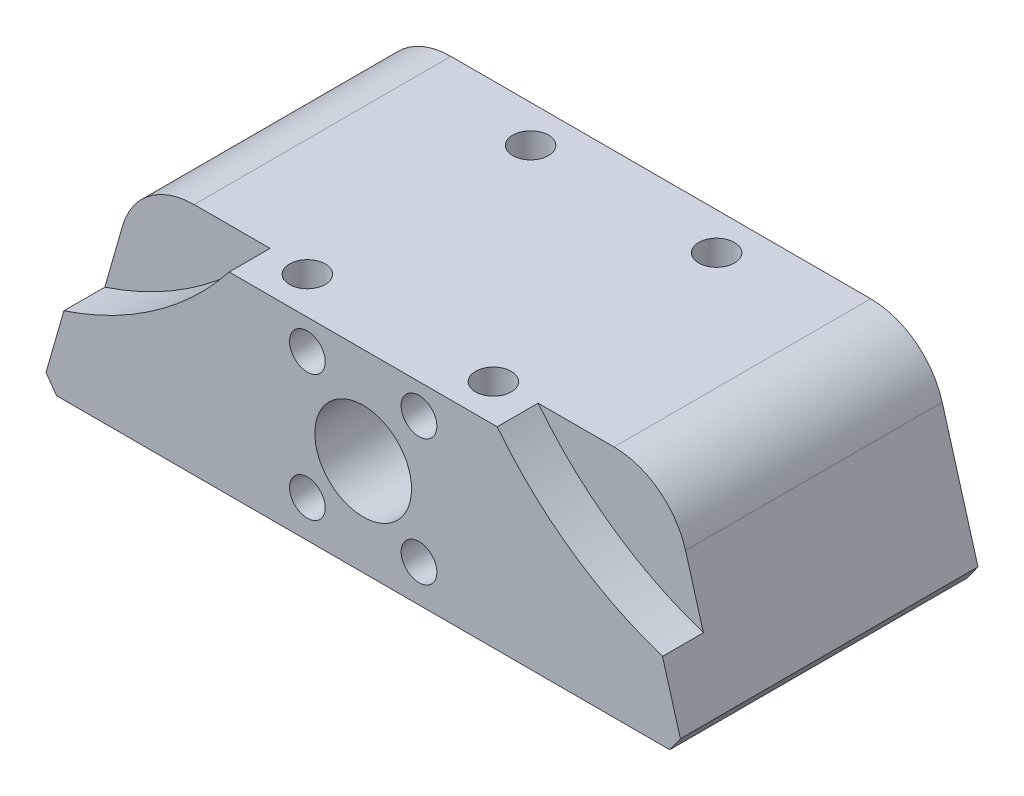
ISO-10303-21;
HEADER;
FILE_DESCRIPTION(('STEP AP214'),'2;1');
FILE_NAME('part.step','',(''),(''),'','','');
FILE_SCHEMA(('AUTOMOTIVE_DESIGN { 1 0 10303 214 1 1 1 1 }'));
ENDSEC;
DATA;
#1=APPLICATION_CONTEXT('core data for automotive mechanical design processes');
#2=APPLICATION_PROTOCOL_DEFINITION('international standard','automotive_design',2000,#1);
#3=PRODUCT_CONTEXT('',#1,'mechanical');
#4=PRODUCT('Part','Part','',(#3));
#5=PRODUCT_RELATED_PRODUCT_CATEGORY('part','',(#4));
#6=PRODUCT_DEFINITION_FORMATION('','',#4);
#7=PRODUCT_DEFINITION_CONTEXT('part definition',#1,'design');
#8=PRODUCT_DEFINITION('design','',#6,#7);
#9=PRODUCT_DEFINITION_SHAPE('','',#8);
#10=(LENGTH_UNIT() NAMED_UNIT(*) SI_UNIT(.MILLI.,.METRE.));
#11=(NAMED_UNIT(*) PLANE_ANGLE_UNIT() SI_UNIT($,.RADIAN.));
#12=(NAMED_UNIT(*) SI_UNIT($,.STERADIAN.) SOLID_ANGLE_UNIT());
#13=UNCERTAINTY_MEASURE_WITH_UNIT(LENGTH_MEASURE(1.E-05),#10,'distance_accuracy_value','');
#14=(GEOMETRIC_REPRESENTATION_CONTEXT(3) GLOBAL_UNCERTAINTY_ASSIGNED_CONTEXT((#13)) GLOBAL_UNIT_ASSIGNED_CONTEXT((#10,
#11,#12)) REPRESENTATION_CONTEXT('',''));
#15=CARTESIAN_POINT('',(0.,0.,0.));
#16=DIRECTION('',(0.,0.,1.));
#17=DIRECTION('',(1.,0.,0.));
#18=AXIS2_PLACEMENT_3D('',#15,#16,#17);
#19=CARTESIAN_POINT('',(-20.7121406356452,11.,40.));
#20=DIRECTION('',(0.,0.,-1.));
#21=DIRECTION('',(-1.,0.,0.));
#22=AXIS2_PLACEMENT_3D('',#19,#20,#21);
#23=CYLINDRICAL_SURFACE('',#22,10.);
#24=DIRECTION('',(0.,0.,-1.));
#25=VECTOR('',#24,1.);
#26=CARTESIAN_POINT('',(-30.3247575950284,13.75637355817,40.));
#27=LINE('',#26,#25);
#28=CARTESIAN_POINT('',(-30.3247575950284,13.75637355817,34.5));
#29=VERTEX_POINT('',#28);
#30=CARTESIAN_POINT('',(-30.3247575950284,13.75637355817,0.));
#31=VERTEX_POINT('',#30);
#32=EDGE_CURVE('E202',#29,#31,#27,.T.);
#33=ORIENTED_EDGE('',*,*,#32,.F.);
#34=CARTESIAN_POINT('',(-20.7121406356452,11.,34.5));
#35=DIRECTION('',(0.,0.,1.));
#36=DIRECTION('',(1.,0.,0.));
#37=AXIS2_PLACEMENT_3D('',#34,#35,#36);
#38=CIRCLE('',#37,10.);
#39=CARTESIAN_POINT('',(-20.7121406356452,21.,34.5));
#40=VERTEX_POINT('',#39);
#41=EDGE_CURVE('E205',#29,#40,#38,.F.);
#42=ORIENTED_EDGE('',*,*,#41,.T.);
#43=DIRECTION('',(0.,0.,-1.));
#44=VECTOR('',#43,1.);
#45=CARTESIAN_POINT('',(-20.7121406356452,21.,40.));
#46=LINE('',#45,#44);
#47=CARTESIAN_POINT('',(-20.7121406356452,21.,0.));
#48=VERTEX_POINT('',#47);
#49=EDGE_CURVE('E173',#48,#40,#46,.F.);
#50=ORIENTED_EDGE('',*,*,#49,.F.);
#51=CARTESIAN_POINT('',(-20.7121406356452,11.,0.));
#52=DIRECTION('',(0.,0.,1.));
#53=DIRECTION('',(1.,0.,0.));
#54=AXIS2_PLACEMENT_3D('',#51,#52,#53);
#55=CIRCLE('',#54,10.);
#56=EDGE_CURVE('E191',#31,#48,#55,.F.);
#57=ORIENTED_EDGE('',*,*,#56,.F.);
#58=EDGE_LOOP('',(#33,#42,#50,#57));
#59=FACE_BOUND('',#58,.T.);
#60=ADVANCED_FACE('F39',(#59),#23,.T.);
#61=CARTESIAN_POINT('',(0.,0.,40.));
#62=DIRECTION('',(0.,0.,1.));
#63=DIRECTION('',(1.,0.,0.));
#64=AXIS2_PLACEMENT_3D('',#61,#62,#63);
#65=PLANE('',#64);
#66=DIRECTION('',(0.580682206213755,0.814130318429873,0.));
#67=VECTOR('',#66,1.);
#68=CARTESIAN_POINT('',(50.1295703948846,-2.99999999999999,40.));
#69=LINE('',#68,#67);
#70=CARTESIAN_POINT('',(48.7030611664022,-4.99999999999999,40.));
#71=VERTEX_POINT('',#70);
#72=CARTESIAN_POINT('',(50.1295703948846,-2.99999999999999,40.));
#73=VERTEX_POINT('',#72);
#74=EDGE_CURVE('E54',#71,#73,#69,.T.);
#75=ORIENTED_EDGE('',*,*,#74,.T.);
#76=DIRECTION('',(-0.275637355817003,0.961261695938318,0.));
#77=VECTOR('',#76,1.);
#78=CARTESIAN_POINT('',(43.2476811366731,21.,40.));
#79=LINE('',#78,#77);
#80=CARTESIAN_POINT('',(47.7259466078998,5.3824323122901,40.));
#81=VERTEX_POINT('',#80);
#82=EDGE_CURVE('E141',#73,#81,#79,.T.);
#83=ORIENTED_EDGE('',*,*,#82,.T.);
#84=CARTESIAN_POINT('',(62.5,50.,40.));
#85=DIRECTION('',(0.,0.,1.));
#86=DIRECTION('',(-1.,0.,0.));
#87=AXIS2_PLACEMENT_3D('',#84,#85,#86);
#88=CIRCLE('',#87,47.);
#89=CARTESIAN_POINT('',(25.5135159821861,21.,40.));
#90=VERTEX_POINT('',#89);
#91=EDGE_CURVE('E236',#90,#81,#88,.T.);
#92=ORIENTED_EDGE('',*,*,#91,.F.);
#93=DIRECTION('',(-1.,0.,0.));
#94=VECTOR('',#93,1.);
#95=CARTESIAN_POINT('',(-28.2476811366731,21.,40.));
#96=LINE('',#95,#94);
#97=CARTESIAN_POINT('',(-10.5135159821861,21.,40.));
#98=VERTEX_POINT('',#97);
#99=EDGE_CURVE('E153',#90,#98,#96,.T.);
#100=ORIENTED_EDGE('',*,*,#99,.T.);
#101=CARTESIAN_POINT('',(-47.5,50.,40.));
#102=DIRECTION('',(0.,0.,1.));
#103=DIRECTION('',(1.,0.,0.));
#104=AXIS2_PLACEMENT_3D('',#101,#102,#103);
#105=CIRCLE('',#104,47.);
#106=CARTESIAN_POINT('',(-32.7259466078998,5.38243231229012,40.));
#107=VERTEX_POINT('',#106);
#108=EDGE_CURVE('E224',#107,#98,#105,.T.);
#109=ORIENTED_EDGE('',*,*,#108,.F.);
#110=DIRECTION('',(-0.275637355817003,-0.961261695938318,0.));
#111=VECTOR('',#110,1.);
#112=CARTESIAN_POINT('',(-28.2476811366731,21.,40.));
#113=LINE('',#112,#111);
#114=CARTESIAN_POINT('',(-35.1295703948846,-2.99999999999998,40.));
#115=VERTEX_POINT('',#114);
#116=EDGE_CURVE('E159',#107,#115,#113,.T.);
#117=ORIENTED_EDGE('',*,*,#116,.T.);
#118=DIRECTION('',(0.580682206213755,-0.814130318429873,0.));
#119=VECTOR('',#118,1.);
#120=CARTESIAN_POINT('',(-35.1295703948846,-2.99999999999998,40.));
#121=LINE('',#120,#119);
#122=CARTESIAN_POINT('',(-33.7030611664022,-4.99999999999998,40.));
#123=VERTEX_POINT('',#122);
#124=EDGE_CURVE('E361',#115,#123,#121,.T.);
#125=ORIENTED_EDGE('',*,*,#124,.T.);
#126=DIRECTION('',(1.,0.,0.));
#127=VECTOR('',#126,1.);
#128=CARTESIAN_POINT('',(-35.7030611664022,-5.,40.));
#129=LINE('',#128,#127);
#130=EDGE_CURVE('E145',#123,#71,#129,.T.);
#131=ORIENTED_EDGE('',*,*,#130,.T.);
#132=EDGE_LOOP('',(#75,#83,#92,#100,#109,#117,#125,#131));
#133=FACE_BOUND('',#132,.T.);
#134=CARTESIAN_POINT('',(0.,0.,40.));
#135=DIRECTION('',(0.,0.,1.));
#136=DIRECTION('',(1.,0.,0.));
#137=AXIS2_PLACEMENT_3D('',#134,#135,#136);
#138=CIRCLE('',#137,2.4);
#139=CARTESIAN_POINT('',(2.4,0.,40.));
#140=VERTEX_POINT('',#139);
#141=EDGE_CURVE('E300',#140,#140,#138,.T.);
#142=ORIENTED_EDGE('',*,*,#141,.F.);
#143=EDGE_LOOP('',(#142));
#144=FACE_BOUND('',#143,.T.);
#145=CARTESIAN_POINT('',(15.,0.,40.));
#146=DIRECTION('',(0.,0.,1.));
#147=DIRECTION('',(1.,0.,0.));
#148=AXIS2_PLACEMENT_3D('',#145,#146,#147);
#149=CIRCLE('',#148,2.4);
#150=CARTESIAN_POINT('',(17.4,0.,40.));
#151=VERTEX_POINT('',#150);
#152=EDGE_CURVE('E316',#151,#151,#149,.T.);
#153=ORIENTED_EDGE('',*,*,#152,.F.);
#154=EDGE_LOOP('',(#153));
#155=FACE_BOUND('',#154,.T.);
#156=CARTESIAN_POINT('',(15.,17.,40.));
#157=DIRECTION('',(0.,0.,1.));
#158=DIRECTION('',(1.,0.,0.));
#159=AXIS2_PLACEMENT_3D('',#156,#157,#158);
#160=CIRCLE('',#159,2.4);
#161=CARTESIAN_POINT('',(17.4,17.,40.));
#162=VERTEX_POINT('',#161);
#163=EDGE_CURVE('E178',#162,#162,#160,.T.);
#164=ORIENTED_EDGE('',*,*,#163,.F.);
#165=EDGE_LOOP('',(#164));
#166=FACE_BOUND('',#165,.T.);
#167=CARTESIAN_POINT('',(0.,17.,40.));
#168=DIRECTION('',(0.,0.,1.));
#169=DIRECTION('',(1.,0.,0.));
#170=AXIS2_PLACEMENT_3D('',#167,#168,#169);
#171=CIRCLE('',#170,2.4);
#172=CARTESIAN_POINT('',(2.4,17.,40.));
#173=VERTEX_POINT('',#172);
#174=EDGE_CURVE('E308',#173,#173,#171,.T.);
#175=ORIENTED_EDGE('',*,*,#174,.F.);
#176=EDGE_LOOP('',(#175));
#177=FACE_BOUND('',#176,.T.);
#178=CARTESIAN_POINT('',(7.5,8.,40.));
#179=DIRECTION('',(0.,0.,1.));
#180=DIRECTION('',(1.,0.,0.));
#181=AXIS2_PLACEMENT_3D('',#178,#179,#180);
#182=CIRCLE('',#181,6.5);
#183=CARTESIAN_POINT('',(14.,8.,40.));
#184=VERTEX_POINT('',#183);
#185=EDGE_CURVE('E292',#184,#184,#182,.T.);
#186=ORIENTED_EDGE('',*,*,#185,.F.);
#187=EDGE_LOOP('',(#186));
#188=FACE_BOUND('',#187,.T.);
#189=ADVANCED_FACE('F138',(#133,#144,#155,#166,#177,#188),#65,.T.);
#190=CARTESIAN_POINT('',(0.,0.,0.));
#191=DIRECTION('',(0.,0.,1.));
#192=DIRECTION('',(1.,0.,0.));
#193=AXIS2_PLACEMENT_3D('',#190,#191,#192);
#194=PLANE('',#193);
#195=DIRECTION('',(-0.275637355817003,0.961261695938318,0.));
#196=VECTOR('',#195,1.);
#197=CARTESIAN_POINT('',(43.2476811366731,21.,0.));
#198=LINE('',#197,#196);
#199=CARTESIAN_POINT('',(50.1295703948846,-2.99999999999999,0.));
#200=VERTEX_POINT('',#199);
#201=CARTESIAN_POINT('',(45.3247575950284,13.75637355817,0.));
#202=VERTEX_POINT('',#201);
#203=EDGE_CURVE('E174',#200,#202,#198,.T.);
#204=ORIENTED_EDGE('',*,*,#203,.F.);
#205=DIRECTION('',(0.580682206213755,0.814130318429873,0.));
#206=VECTOR('',#205,1.);
#207=CARTESIAN_POINT('',(50.1295703948846,-2.99999999999999,0.));
#208=LINE('',#207,#206);
#209=CARTESIAN_POINT('',(48.7030611664022,-4.99999999999999,0.));
#210=VERTEX_POINT('',#209);
#211=EDGE_CURVE('E129',#210,#200,#208,.T.);
#212=ORIENTED_EDGE('',*,*,#211,.F.);
#213=DIRECTION('',(1.,0.,0.));
#214=VECTOR('',#213,1.);
#215=CARTESIAN_POINT('',(-35.7030611664022,-5.,0.));
#216=LINE('',#215,#214);
#217=CARTESIAN_POINT('',(-33.7030611664022,-5.,0.));
#218=VERTEX_POINT('',#217);
#219=EDGE_CURVE('E154',#218,#210,#216,.T.);
#220=ORIENTED_EDGE('',*,*,#219,.F.);
#221=DIRECTION('',(0.580682206213755,-0.814130318429873,0.));
#222=VECTOR('',#221,1.);
#223=CARTESIAN_POINT('',(-35.1295703948846,-2.99999999999998,0.));
#224=LINE('',#223,#222);
#225=CARTESIAN_POINT('',(-35.1295703948846,-2.99999999999998,0.));
#226=VERTEX_POINT('',#225);
#227=EDGE_CURVE('E62',#226,#218,#224,.T.);
#228=ORIENTED_EDGE('',*,*,#227,.F.);
#229=DIRECTION('',(-0.275637355817003,-0.961261695938318,0.));
#230=VECTOR('',#229,1.);
#231=CARTESIAN_POINT('',(-28.2476811366731,21.,0.));
#232=LINE('',#231,#230);
#233=EDGE_CURVE('E162',#31,#226,#232,.T.);
#234=ORIENTED_EDGE('',*,*,#233,.F.);
#235=ORIENTED_EDGE('',*,*,#56,.T.);
#236=DIRECTION('',(-1.,0.,0.));
#237=VECTOR('',#236,1.);
#238=CARTESIAN_POINT('',(-28.2476811366731,21.,0.));
#239=LINE('',#238,#237);
#240=CARTESIAN_POINT('',(35.7121406356452,21.,0.));
#241=VERTEX_POINT('',#240);
#242=EDGE_CURVE('E177',#241,#48,#239,.T.);
#243=ORIENTED_EDGE('',*,*,#242,.F.);
#244=CARTESIAN_POINT('',(35.7121406356452,11.,0.));
#245=DIRECTION('',(0.,0.,1.));
#246=DIRECTION('',(1.,0.,0.));
#247=AXIS2_PLACEMENT_3D('',#244,#245,#246);
#248=CIRCLE('',#247,10.);
#249=EDGE_CURVE('E194',#241,#202,#248,.F.);
#250=ORIENTED_EDGE('',*,*,#249,.T.);
#251=EDGE_LOOP('',(#204,#212,#220,#228,#234,#235,#243,#250));
#252=FACE_BOUND('',#251,.T.);
#253=CARTESIAN_POINT('',(15.,17.,0.));
#254=DIRECTION('',(0.,0.,1.));
#255=DIRECTION('',(1.,0.,0.));
#256=AXIS2_PLACEMENT_3D('',#253,#254,#255);
#257=CIRCLE('',#256,2.4);
#258=CARTESIAN_POINT('',(17.4,17.,0.));
#259=VERTEX_POINT('',#258);
#260=EDGE_CURVE('E165',#259,#259,#257,.T.);
#261=ORIENTED_EDGE('',*,*,#260,.T.);
#262=EDGE_LOOP('',(#261));
#263=FACE_BOUND('',#262,.T.);
#264=CARTESIAN_POINT('',(15.,0.,0.));
#265=DIRECTION('',(0.,0.,1.));
#266=DIRECTION('',(1.,0.,0.));
#267=AXIS2_PLACEMENT_3D('',#264,#265,#266);
#268=CIRCLE('',#267,2.4);
#269=CARTESIAN_POINT('',(17.4,0.,0.));
#270=VERTEX_POINT('',#269);
#271=EDGE_CURVE('E312',#270,#270,#268,.T.);
#272=ORIENTED_EDGE('',*,*,#271,.T.);
#273=EDGE_LOOP('',(#272));
#274=FACE_BOUND('',#273,.T.);
#275=CARTESIAN_POINT('',(0.,17.,0.));
#276=DIRECTION('',(0.,0.,1.));
#277=DIRECTION('',(1.,0.,0.));
#278=AXIS2_PLACEMENT_3D('',#275,#276,#277);
#279=CIRCLE('',#278,2.4);
#280=CARTESIAN_POINT('',(2.4,17.,0.));
#281=VERTEX_POINT('',#280);
#282=EDGE_CURVE('E304',#281,#281,#279,.T.);
#283=ORIENTED_EDGE('',*,*,#282,.T.);
#284=EDGE_LOOP('',(#283));
#285=FACE_BOUND('',#284,.T.);
#286=CARTESIAN_POINT('',(0.,0.,0.));
#287=DIRECTION('',(0.,0.,1.));
#288=DIRECTION('',(1.,0.,0.));
#289=AXIS2_PLACEMENT_3D('',#286,#287,#288);
#290=CIRCLE('',#289,2.4);
#291=CARTESIAN_POINT('',(2.4,0.,0.));
#292=VERTEX_POINT('',#291);
#293=EDGE_CURVE('E296',#292,#292,#290,.T.);
#294=ORIENTED_EDGE('',*,*,#293,.T.);
#295=EDGE_LOOP('',(#294));
#296=FACE_BOUND('',#295,.T.);
#297=CARTESIAN_POINT('',(7.5,8.,0.));
#298=DIRECTION('',(0.,0.,1.));
#299=DIRECTION('',(1.,0.,0.));
#300=AXIS2_PLACEMENT_3D('',#297,#298,#299);
#301=CIRCLE('',#300,6.5);
#302=CARTESIAN_POINT('',(14.,8.,0.));
#303=VERTEX_POINT('',#302);
#304=EDGE_CURVE('E288',#303,#303,#301,.T.);
#305=ORIENTED_EDGE('',*,*,#304,.T.);
#306=EDGE_LOOP('',(#305));
#307=FACE_BOUND('',#306,.T.);
#308=ADVANCED_FACE('F330',(#252,#263,#274,#285,#296,#307),#194,.F.);
#309=CARTESIAN_POINT('',(43.2476811366731,21.,40.));
#310=DIRECTION('',(-0.961261695938318,-0.275637355817003,0.));
#311=DIRECTION('',(0.275637355817003,-0.961261695938318,0.));
#312=AXIS2_PLACEMENT_3D('',#309,#310,#311);
#313=PLANE('',#312);
#314=ORIENTED_EDGE('',*,*,#82,.F.);
#315=DIRECTION('',(0.,0.,-1.));
#316=VECTOR('',#315,1.);
#317=CARTESIAN_POINT('',(50.1295703948846,-2.99999999999999,40.));
#318=LINE('',#317,#316);
#319=EDGE_CURVE('E126',#73,#200,#318,.T.);
#320=ORIENTED_EDGE('',*,*,#319,.T.);
#321=ORIENTED_EDGE('',*,*,#203,.T.);
#322=DIRECTION('',(0.,0.,-1.));
#323=VECTOR('',#322,1.);
#324=CARTESIAN_POINT('',(45.3247575950284,13.75637355817,40.));
#325=LINE('',#324,#323);
#326=CARTESIAN_POINT('',(45.3247575950284,13.75637355817,34.5));
#327=VERTEX_POINT('',#326);
#328=EDGE_CURVE('E198',#202,#327,#325,.F.);
#329=ORIENTED_EDGE('',*,*,#328,.T.);
#330=DIRECTION('',(0.275637355817003,-0.961261695938318,0.));
#331=VECTOR('',#330,1.);
#332=CARTESIAN_POINT('',(43.2476811366731,21.,34.5));
#333=LINE('',#332,#331);
#334=CARTESIAN_POINT('',(47.7259466078998,5.3824323122901,34.5));
#335=VERTEX_POINT('',#334);
#336=EDGE_CURVE('E251',#327,#335,#333,.T.);
#337=ORIENTED_EDGE('',*,*,#336,.T.);
#338=DIRECTION('',(0.,0.,1.));
#339=VECTOR('',#338,1.);
#340=CARTESIAN_POINT('',(47.7259466078998,5.3824323122901,34.5));
#341=LINE('',#340,#339);
#342=EDGE_CURVE('E151',#335,#81,#341,.T.);
#343=ORIENTED_EDGE('',*,*,#342,.T.);
#344=EDGE_LOOP('',(#314,#320,#321,#329,#337,#343));
#345=FACE_BOUND('',#344,.T.);
#346=ADVANCED_FACE('F149',(#345),#313,.F.);
#347=CARTESIAN_POINT('',(-28.2476811366731,21.,40.));
#348=DIRECTION('',(0.,-1.,0.));
#349=DIRECTION('',(1.,0.,0.));
#350=AXIS2_PLACEMENT_3D('',#347,#348,#349);
#351=PLANE('',#350);
#352=CARTESIAN_POINT('',(20.,21.,5.));
#353=DIRECTION('',(0.,1.,0.));
#354=DIRECTION('',(-1.,0.,0.));
#355=AXIS2_PLACEMENT_3D('',#352,#353,#354);
#356=CIRCLE('',#355,2.4);
#357=CARTESIAN_POINT('',(17.6,21.,5.));
#358=VERTEX_POINT('',#357);
#359=EDGE_CURVE('E273',#358,#358,#356,.T.);
#360=ORIENTED_EDGE('',*,*,#359,.F.);
#361=EDGE_LOOP('',(#360));
#362=FACE_BOUND('',#361,.T.);
#363=CARTESIAN_POINT('',(-5.00000000000001,21.,35.));
#364=DIRECTION('',(0.,1.,0.));
#365=DIRECTION('',(-1.,0.,0.));
#366=AXIS2_PLACEMENT_3D('',#363,#364,#365);
#367=CIRCLE('',#366,2.4);
#368=CARTESIAN_POINT('',(-7.40000000000001,21.,35.));
#369=VERTEX_POINT('',#368);
#370=EDGE_CURVE('E264',#369,#369,#367,.T.);
#371=ORIENTED_EDGE('',*,*,#370,.F.);
#372=EDGE_LOOP('',(#371));
#373=FACE_BOUND('',#372,.T.);
#374=CARTESIAN_POINT('',(20.,21.,35.));
#375=DIRECTION('',(0.,1.,0.));
#376=DIRECTION('',(-1.,0.,0.));
#377=AXIS2_PLACEMENT_3D('',#374,#375,#376);
#378=CIRCLE('',#377,2.4);
#379=CARTESIAN_POINT('',(17.6,21.,35.));
#380=VERTEX_POINT('',#379);
#381=EDGE_CURVE('E259',#380,#380,#378,.T.);
#382=ORIENTED_EDGE('',*,*,#381,.F.);
#383=EDGE_LOOP('',(#382));
#384=FACE_BOUND('',#383,.T.);
#385=CARTESIAN_POINT('',(-5.00000000000001,21.,5.));
#386=DIRECTION('',(0.,1.,0.));
#387=DIRECTION('',(-1.,0.,0.));
#388=AXIS2_PLACEMENT_3D('',#385,#386,#387);
#389=CIRCLE('',#388,2.4);
#390=CARTESIAN_POINT('',(-7.40000000000001,21.,5.));
#391=VERTEX_POINT('',#390);
#392=EDGE_CURVE('E272',#391,#391,#389,.T.);
#393=ORIENTED_EDGE('',*,*,#392,.F.);
#394=EDGE_LOOP('',(#393));
#395=FACE_BOUND('',#394,.T.);
#396=DIRECTION('',(-1.,0.,0.));
#397=VECTOR('',#396,1.);
#398=CARTESIAN_POINT('',(-28.2476811366731,21.,34.5));
#399=LINE('',#398,#397);
#400=CARTESIAN_POINT('',(-10.5135159821861,21.,34.5));
#401=VERTEX_POINT('',#400);
#402=EDGE_CURVE('E244',#401,#40,#399,.T.);
#403=ORIENTED_EDGE('',*,*,#402,.F.);
#404=DIRECTION('',(0.,0.,1.));
#405=VECTOR('',#404,1.);
#406=CARTESIAN_POINT('',(-10.5135159821861,21.,34.5));
#407=LINE('',#406,#405);
#408=EDGE_CURVE('E254',#401,#98,#407,.T.);
#409=ORIENTED_EDGE('',*,*,#408,.T.);
#410=ORIENTED_EDGE('',*,*,#99,.F.);
#411=DIRECTION('',(0.,0.,1.));
#412=VECTOR('',#411,1.);
#413=CARTESIAN_POINT('',(25.5135159821861,21.,34.5));
#414=LINE('',#413,#412);
#415=CARTESIAN_POINT('',(25.5135159821861,21.,34.5));
#416=VERTEX_POINT('',#415);
#417=EDGE_CURVE('E11',#90,#416,#414,.F.);
#418=ORIENTED_EDGE('',*,*,#417,.T.);
#419=DIRECTION('',(1.,0.,0.));
#420=VECTOR('',#419,1.);
#421=CARTESIAN_POINT('',(-28.2476811366731,21.,34.5));
#422=LINE('',#421,#420);
#423=CARTESIAN_POINT('',(35.7121406356452,21.,34.5));
#424=VERTEX_POINT('',#423);
#425=EDGE_CURVE('E247',#416,#424,#422,.T.);
#426=ORIENTED_EDGE('',*,*,#425,.T.);
#427=DIRECTION('',(0.,0.,-1.));
#428=VECTOR('',#427,1.);
#429=CARTESIAN_POINT('',(35.7121406356452,21.,40.));
#430=LINE('',#429,#428);
#431=EDGE_CURVE('E188',#424,#241,#430,.T.);
#432=ORIENTED_EDGE('',*,*,#431,.T.);
#433=ORIENTED_EDGE('',*,*,#242,.T.);
#434=ORIENTED_EDGE('',*,*,#49,.T.);
#435=EDGE_LOOP('',(#403,#409,#410,#418,#426,#432,#433,#434));
#436=FACE_BOUND('',#435,.T.);
#437=ADVANCED_FACE('F386',(#362,#373,#384,#395,#436),#351,.F.);
#438=CARTESIAN_POINT('',(-28.2476811366731,21.,40.));
#439=DIRECTION('',(0.961261695938318,-0.275637355817003,0.));
#440=DIRECTION('',(0.275637355817003,0.961261695938318,0.));
#441=AXIS2_PLACEMENT_3D('',#438,#439,#440);
#442=PLANE('',#441);
#443=ORIENTED_EDGE('',*,*,#233,.T.);
#444=DIRECTION('',(0.,0.,-1.));
#445=VECTOR('',#444,1.);
#446=CARTESIAN_POINT('',(-35.1295703948846,-2.99999999999998,40.));
#447=LINE('',#446,#445);
#448=EDGE_CURVE('E356',#115,#226,#447,.T.);
#449=ORIENTED_EDGE('',*,*,#448,.F.);
#450=ORIENTED_EDGE('',*,*,#116,.F.);
#451=DIRECTION('',(0.,0.,1.));
#452=VECTOR('',#451,1.);
#453=CARTESIAN_POINT('',(-32.7259466078998,5.38243231229012,34.5));
#454=LINE('',#453,#452);
#455=CARTESIAN_POINT('',(-32.7259466078998,5.38243231229012,34.5));
#456=VERTEX_POINT('',#455);
#457=EDGE_CURVE('E47',#107,#456,#454,.F.);
#458=ORIENTED_EDGE('',*,*,#457,.T.);
#459=DIRECTION('',(-0.275637355817003,-0.961261695938318,0.));
#460=VECTOR('',#459,1.);
#461=CARTESIAN_POINT('',(-28.2476811366731,21.,34.5));
#462=LINE('',#461,#460);
#463=EDGE_CURVE('E217',#29,#456,#462,.T.);
#464=ORIENTED_EDGE('',*,*,#463,.F.);
#465=ORIENTED_EDGE('',*,*,#32,.T.);
#466=EDGE_LOOP('',(#443,#449,#450,#458,#464,#465));
#467=FACE_BOUND('',#466,.T.);
#468=ADVANCED_FACE('F216',(#467),#442,.F.);
#469=CARTESIAN_POINT('',(-35.7030611664022,-5.,40.));
#470=DIRECTION('',(0.,1.,0.));
#471=DIRECTION('',(-1.,0.,0.));
#472=AXIS2_PLACEMENT_3D('',#469,#470,#471);
#473=PLANE('',#472);
#474=CARTESIAN_POINT('',(20.,-5.,5.));
#475=DIRECTION('',(0.,1.,0.));
#476=DIRECTION('',(-1.,0.,0.));
#477=AXIS2_PLACEMENT_3D('',#474,#475,#476);
#478=CIRCLE('',#477,2.4);
#479=CARTESIAN_POINT('',(17.6,-5.,5.));
#480=VERTEX_POINT('',#479);
#481=EDGE_CURVE('E268',#480,#480,#478,.T.);
#482=ORIENTED_EDGE('',*,*,#481,.T.);
#483=EDGE_LOOP('',(#482));
#484=FACE_BOUND('',#483,.T.);
#485=CARTESIAN_POINT('',(-5.,-5.00000000000001,35.));
#486=DIRECTION('',(0.,1.,0.));
#487=DIRECTION('',(-1.,0.,0.));
#488=AXIS2_PLACEMENT_3D('',#485,#486,#487);
#489=CIRCLE('',#488,2.4);
#490=CARTESIAN_POINT('',(-7.4,-5.00000000000001,35.));
#491=VERTEX_POINT('',#490);
#492=EDGE_CURVE('E277',#491,#491,#489,.T.);
#493=ORIENTED_EDGE('',*,*,#492,.T.);
#494=EDGE_LOOP('',(#493));
#495=FACE_BOUND('',#494,.T.);
#496=CARTESIAN_POINT('',(20.,-5.,35.));
#497=DIRECTION('',(0.,1.,0.));
#498=DIRECTION('',(-1.,0.,0.));
#499=AXIS2_PLACEMENT_3D('',#496,#497,#498);
#500=CIRCLE('',#499,2.4);
#501=CARTESIAN_POINT('',(17.6,-5.,35.));
#502=VERTEX_POINT('',#501);
#503=EDGE_CURVE('E260',#502,#502,#500,.T.);
#504=ORIENTED_EDGE('',*,*,#503,.T.);
#505=EDGE_LOOP('',(#504));
#506=FACE_BOUND('',#505,.T.);
#507=CARTESIAN_POINT('',(-5.00000000000001,-5.00000000000001,5.));
#508=DIRECTION('',(0.,1.,0.));
#509=DIRECTION('',(-1.,0.,0.));
#510=AXIS2_PLACEMENT_3D('',#507,#508,#509);
#511=CIRCLE('',#510,2.4);
#512=CARTESIAN_POINT('',(-7.40000000000001,-5.00000000000001,5.));
#513=VERTEX_POINT('',#512);
#514=EDGE_CURVE('E284',#513,#513,#511,.T.);
#515=ORIENTED_EDGE('',*,*,#514,.T.);
#516=EDGE_LOOP('',(#515));
#517=FACE_BOUND('',#516,.T.);
#518=ORIENTED_EDGE('',*,*,#219,.T.);
#519=DIRECTION('',(0.,0.,-1.));
#520=VECTOR('',#519,1.);
#521=CARTESIAN_POINT('',(48.7030611664022,-4.99999999999999,40.));
#522=LINE('',#521,#520);
#523=EDGE_CURVE('E134',#71,#210,#522,.T.);
#524=ORIENTED_EDGE('',*,*,#523,.F.);
#525=ORIENTED_EDGE('',*,*,#130,.F.);
#526=DIRECTION('',(0.,0.,-1.));
#527=VECTOR('',#526,1.);
#528=CARTESIAN_POINT('',(-33.7030611664022,-4.99999999999998,40.));
#529=LINE('',#528,#527);
#530=EDGE_CURVE('E366',#123,#218,#529,.T.);
#531=ORIENTED_EDGE('',*,*,#530,.T.);
#532=EDGE_LOOP('',(#518,#524,#525,#531));
#533=FACE_BOUND('',#532,.T.);
#534=ADVANCED_FACE('F336',(#484,#495,#506,#517,#533),#473,.F.);
#535=CARTESIAN_POINT('',(15.,17.,40.));
#536=DIRECTION('',(0.,0.,-1.));
#537=DIRECTION('',(-1.,0.,0.));
#538=AXIS2_PLACEMENT_3D('',#535,#536,#537);
#539=CYLINDRICAL_SURFACE('',#538,2.4);
#540=ORIENTED_EDGE('',*,*,#163,.T.);
#541=EDGE_LOOP('',(#540));
#542=FACE_BOUND('',#541,.T.);
#543=ORIENTED_EDGE('',*,*,#260,.F.);
#544=EDGE_LOOP('',(#543));
#545=FACE_BOUND('',#544,.T.);
#546=ADVANCED_FACE('F333',(#542,#545),#539,.F.);
#547=CARTESIAN_POINT('',(15.,0.,40.));
#548=DIRECTION('',(0.,0.,-1.));
#549=DIRECTION('',(-1.,0.,0.));
#550=AXIS2_PLACEMENT_3D('',#547,#548,#549);
#551=CYLINDRICAL_SURFACE('',#550,2.4);
#552=ORIENTED_EDGE('',*,*,#152,.T.);
#553=EDGE_LOOP('',(#552));
#554=FACE_BOUND('',#553,.T.);
#555=ORIENTED_EDGE('',*,*,#271,.F.);
#556=EDGE_LOOP('',(#555));
#557=FACE_BOUND('',#556,.T.);
#558=ADVANCED_FACE('F335',(#554,#557),#551,.F.);
#559=CARTESIAN_POINT('',(0.,17.,40.));
#560=DIRECTION('',(0.,0.,-1.));
#561=DIRECTION('',(-1.,0.,0.));
#562=AXIS2_PLACEMENT_3D('',#559,#560,#561);
#563=CYLINDRICAL_SURFACE('',#562,2.4);
#564=ORIENTED_EDGE('',*,*,#174,.T.);
#565=EDGE_LOOP('',(#564));
#566=FACE_BOUND('',#565,.T.);
#567=ORIENTED_EDGE('',*,*,#282,.F.);
#568=EDGE_LOOP('',(#567));
#569=FACE_BOUND('',#568,.T.);
#570=ADVANCED_FACE('F342',(#566,#569),#563,.F.);
#571=CARTESIAN_POINT('',(0.,0.,40.));
#572=DIRECTION('',(0.,0.,-1.));
#573=DIRECTION('',(-1.,0.,0.));
#574=AXIS2_PLACEMENT_3D('',#571,#572,#573);
#575=CYLINDRICAL_SURFACE('',#574,2.4);
#576=ORIENTED_EDGE('',*,*,#141,.T.);
#577=EDGE_LOOP('',(#576));
#578=FACE_BOUND('',#577,.T.);
#579=ORIENTED_EDGE('',*,*,#293,.F.);
#580=EDGE_LOOP('',(#579));
#581=FACE_BOUND('',#580,.T.);
#582=ADVANCED_FACE('F420',(#578,#581),#575,.F.);
#583=CARTESIAN_POINT('',(7.5,8.,40.));
#584=DIRECTION('',(0.,0.,-1.));
#585=DIRECTION('',(-1.,0.,0.));
#586=AXIS2_PLACEMENT_3D('',#583,#584,#585);
#587=CYLINDRICAL_SURFACE('',#586,6.5);
#588=ORIENTED_EDGE('',*,*,#185,.T.);
#589=EDGE_LOOP('',(#588));
#590=FACE_BOUND('',#589,.T.);
#591=ORIENTED_EDGE('',*,*,#304,.F.);
#592=EDGE_LOOP('',(#591));
#593=FACE_BOUND('',#592,.T.);
#594=ADVANCED_FACE('F417',(#590,#593),#587,.F.);
#595=CARTESIAN_POINT('',(35.7121406356452,11.,40.));
#596=DIRECTION('',(0.,0.,-1.));
#597=DIRECTION('',(-1.,0.,0.));
#598=AXIS2_PLACEMENT_3D('',#595,#596,#597);
#599=CYLINDRICAL_SURFACE('',#598,10.);
#600=CARTESIAN_POINT('',(35.7121406356452,11.,34.5));
#601=DIRECTION('',(0.,0.,-1.));
#602=DIRECTION('',(-1.,0.,0.));
#603=AXIS2_PLACEMENT_3D('',#600,#601,#602);
#604=CIRCLE('',#603,10.);
#605=EDGE_CURVE('E209',#327,#424,#604,.F.);
#606=ORIENTED_EDGE('',*,*,#605,.F.);
#607=ORIENTED_EDGE('',*,*,#328,.F.);
#608=ORIENTED_EDGE('',*,*,#249,.F.);
#609=ORIENTED_EDGE('',*,*,#431,.F.);
#610=EDGE_LOOP('',(#606,#607,#608,#609));
#611=FACE_BOUND('',#610,.T.);
#612=ADVANCED_FACE('F379',(#611),#599,.T.);
#613=CARTESIAN_POINT('',(-5.00000000000001,-5.00000000000001,5.));
#614=DIRECTION('',(0.,1.,0.));
#615=DIRECTION('',(-1.,0.,0.));
#616=AXIS2_PLACEMENT_3D('',#613,#614,#615);
#617=CYLINDRICAL_SURFACE('',#616,2.4);
#618=ORIENTED_EDGE('',*,*,#514,.F.);
#619=EDGE_LOOP('',(#618));
#620=FACE_BOUND('',#619,.T.);
#621=ORIENTED_EDGE('',*,*,#392,.T.);
#622=EDGE_LOOP('',(#621));
#623=FACE_BOUND('',#622,.T.);
#624=ADVANCED_FACE('F405',(#620,#623),#617,.F.);
#625=CARTESIAN_POINT('',(20.,-5.,35.));
#626=DIRECTION('',(0.,1.,0.));
#627=DIRECTION('',(-1.,0.,0.));
#628=AXIS2_PLACEMENT_3D('',#625,#626,#627);
#629=CYLINDRICAL_SURFACE('',#628,2.4);
#630=ORIENTED_EDGE('',*,*,#503,.F.);
#631=EDGE_LOOP('',(#630));
#632=FACE_BOUND('',#631,.T.);
#633=ORIENTED_EDGE('',*,*,#381,.T.);
#634=EDGE_LOOP('',(#633));
#635=FACE_BOUND('',#634,.T.);
#636=ADVANCED_FACE('F401',(#632,#635),#629,.F.);
#637=CARTESIAN_POINT('',(-5.,-5.00000000000001,35.));
#638=DIRECTION('',(0.,1.,0.));
#639=DIRECTION('',(-1.,0.,0.));
#640=AXIS2_PLACEMENT_3D('',#637,#638,#639);
#641=CYLINDRICAL_SURFACE('',#640,2.4);
#642=ORIENTED_EDGE('',*,*,#492,.F.);
#643=EDGE_LOOP('',(#642));
#644=FACE_BOUND('',#643,.T.);
#645=ORIENTED_EDGE('',*,*,#370,.T.);
#646=EDGE_LOOP('',(#645));
#647=FACE_BOUND('',#646,.T.);
#648=ADVANCED_FACE('F404',(#644,#647),#641,.F.);
#649=CARTESIAN_POINT('',(20.,-5.,5.));
#650=DIRECTION('',(0.,1.,0.));
#651=DIRECTION('',(-1.,0.,0.));
#652=AXIS2_PLACEMENT_3D('',#649,#650,#651);
#653=CYLINDRICAL_SURFACE('',#652,2.4);
#654=ORIENTED_EDGE('',*,*,#481,.F.);
#655=EDGE_LOOP('',(#654));
#656=FACE_BOUND('',#655,.T.);
#657=ORIENTED_EDGE('',*,*,#359,.T.);
#658=EDGE_LOOP('',(#657));
#659=FACE_BOUND('',#658,.T.);
#660=ADVANCED_FACE('F407',(#656,#659),#653,.F.);
#661=CARTESIAN_POINT('',(-47.5,50.,34.5));
#662=DIRECTION('',(0.,0.,1.));
#663=DIRECTION('',(1.,0.,0.));
#664=AXIS2_PLACEMENT_3D('',#661,#662,#663);
#665=CYLINDRICAL_SURFACE('',#664,47.);
#666=CARTESIAN_POINT('',(-47.5,50.,34.5));
#667=DIRECTION('',(0.,0.,1.));
#668=DIRECTION('',(1.,0.,0.));
#669=AXIS2_PLACEMENT_3D('',#666,#667,#668);
#670=CIRCLE('',#669,47.);
#671=EDGE_CURVE('E227',#456,#401,#670,.T.);
#672=ORIENTED_EDGE('',*,*,#671,.F.);
#673=ORIENTED_EDGE('',*,*,#457,.F.);
#674=ORIENTED_EDGE('',*,*,#108,.T.);
#675=ORIENTED_EDGE('',*,*,#408,.F.);
#676=EDGE_LOOP('',(#672,#673,#674,#675));
#677=FACE_BOUND('',#676,.T.);
#678=ADVANCED_FACE('F223',(#677),#665,.F.);
#679=CARTESIAN_POINT('',(-47.5,50.,34.5));
#680=DIRECTION('',(0.,0.,1.));
#681=DIRECTION('',(1.,0.,0.));
#682=AXIS2_PLACEMENT_3D('',#679,#680,#681);
#683=PLANE('',#682);
#684=ORIENTED_EDGE('',*,*,#402,.T.);
#685=ORIENTED_EDGE('',*,*,#41,.F.);
#686=ORIENTED_EDGE('',*,*,#463,.T.);
#687=ORIENTED_EDGE('',*,*,#671,.T.);
#688=EDGE_LOOP('',(#684,#685,#686,#687));
#689=FACE_BOUND('',#688,.T.);
#690=ADVANCED_FACE('F390',(#689),#683,.T.);
#691=CARTESIAN_POINT('',(62.5,50.,34.5));
#692=DIRECTION('',(0.,0.,1.));
#693=DIRECTION('',(1.,0.,0.));
#694=AXIS2_PLACEMENT_3D('',#691,#692,#693);
#695=CYLINDRICAL_SURFACE('',#694,47.);
#696=CARTESIAN_POINT('',(62.5,50.,34.5));
#697=DIRECTION('',(0.,0.,1.));
#698=DIRECTION('',(-1.,0.,0.));
#699=AXIS2_PLACEMENT_3D('',#696,#697,#698);
#700=CIRCLE('',#699,47.);
#701=EDGE_CURVE('E230',#416,#335,#700,.T.);
#702=ORIENTED_EDGE('',*,*,#701,.F.);
#703=ORIENTED_EDGE('',*,*,#417,.F.);
#704=ORIENTED_EDGE('',*,*,#91,.T.);
#705=ORIENTED_EDGE('',*,*,#342,.F.);
#706=EDGE_LOOP('',(#702,#703,#704,#705));
#707=FACE_BOUND('',#706,.T.);
#708=ADVANCED_FACE('F388',(#707),#695,.F.);
#709=CARTESIAN_POINT('',(62.5,50.,34.5));
#710=DIRECTION('',(0.,0.,-1.));
#711=DIRECTION('',(-1.,0.,0.));
#712=AXIS2_PLACEMENT_3D('',#709,#710,#711);
#713=PLANE('',#712);
#714=ORIENTED_EDGE('',*,*,#605,.T.);
#715=ORIENTED_EDGE('',*,*,#425,.F.);
#716=ORIENTED_EDGE('',*,*,#701,.T.);
#717=ORIENTED_EDGE('',*,*,#336,.F.);
#718=EDGE_LOOP('',(#714,#715,#716,#717));
#719=FACE_BOUND('',#718,.T.);
#720=ADVANCED_FACE('F382',(#719),#713,.F.);
#721=CARTESIAN_POINT('',(-35.1295703948846,-2.99999999999998,40.));
#722=DIRECTION('',(0.814130318429873,0.580682206213755,0.));
#723=DIRECTION('',(-0.580682206213755,0.814130318429873,0.));
#724=AXIS2_PLACEMENT_3D('',#721,#722,#723);
#725=PLANE('',#724);
#726=ORIENTED_EDGE('',*,*,#227,.T.);
#727=ORIENTED_EDGE('',*,*,#530,.F.);
#728=ORIENTED_EDGE('',*,*,#124,.F.);
#729=ORIENTED_EDGE('',*,*,#448,.T.);
#730=EDGE_LOOP('',(#726,#727,#728,#729));
#731=FACE_BOUND('',#730,.T.);
#732=ADVANCED_FACE('F369',(#731),#725,.F.);
#733=CARTESIAN_POINT('',(50.1295703948846,-2.99999999999999,40.));
#734=DIRECTION('',(-0.814130318429873,0.580682206213755,0.));
#735=DIRECTION('',(-0.580682206213755,-0.814130318429873,0.));
#736=AXIS2_PLACEMENT_3D('',#733,#734,#735);
#737=PLANE('',#736);
#738=ORIENTED_EDGE('',*,*,#211,.T.);
#739=ORIENTED_EDGE('',*,*,#319,.F.);
#740=ORIENTED_EDGE('',*,*,#74,.F.);
#741=ORIENTED_EDGE('',*,*,#523,.T.);
#742=EDGE_LOOP('',(#738,#739,#740,#741));
#743=FACE_BOUND('',#742,.T.);
#744=ADVANCED_FACE('F127',(#743),#737,.F.);
#745=CLOSED_SHELL('',(#60,#189,#308,#346,#437,#468,#534,#546,#558,#570,#582,#594,#612,#624,#636,
#648,#660,#678,#690,#708,#720,#732,#744));
#746=MANIFOLD_SOLID_BREP('B2',#745);
#747=ADVANCED_BREP_SHAPE_REPRESENTATION('',(#18,#746),#14);
#748=SHAPE_DEFINITION_REPRESENTATION(#9,#747);
ENDSEC;
END-ISO-10303-21;
